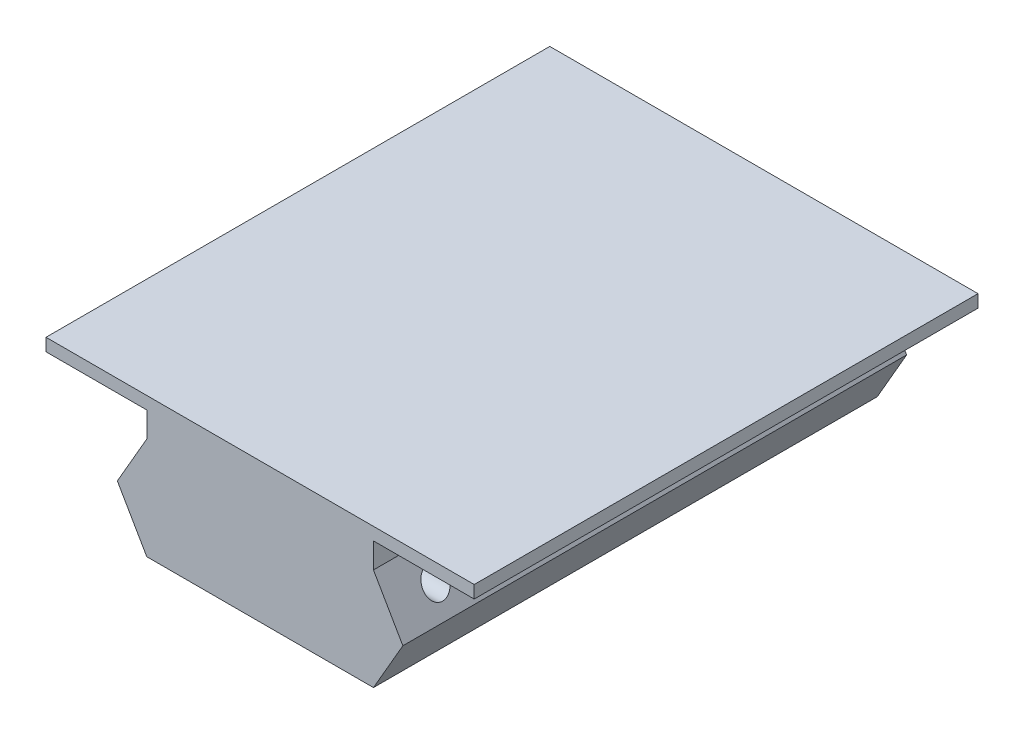
ISO-10303-21;
HEADER;
FILE_DESCRIPTION(('STEP AP214'),'2;1');
FILE_NAME('part.step','',(''),(''),'','','');
FILE_SCHEMA(('AUTOMOTIVE_DESIGN { 1 0 10303 214 1 1 1 1 }'));
ENDSEC;
DATA;
#1=APPLICATION_CONTEXT('core data for automotive mechanical design processes');
#2=APPLICATION_PROTOCOL_DEFINITION('international standard','automotive_design',2000,#1);
#3=PRODUCT_CONTEXT('',#1,'mechanical');
#4=PRODUCT('Part','Part','',(#3));
#5=PRODUCT_RELATED_PRODUCT_CATEGORY('part','',(#4));
#6=PRODUCT_DEFINITION_FORMATION('','',#4);
#7=PRODUCT_DEFINITION_CONTEXT('part definition',#1,'design');
#8=PRODUCT_DEFINITION('design','',#6,#7);
#9=PRODUCT_DEFINITION_SHAPE('','',#8);
#10=(LENGTH_UNIT() NAMED_UNIT(*) SI_UNIT(.MILLI.,.METRE.));
#11=(NAMED_UNIT(*) PLANE_ANGLE_UNIT() SI_UNIT($,.RADIAN.));
#12=(NAMED_UNIT(*) SI_UNIT($,.STERADIAN.) SOLID_ANGLE_UNIT());
#13=UNCERTAINTY_MEASURE_WITH_UNIT(LENGTH_MEASURE(1.E-05),#10,'distance_accuracy_value','');
#14=(GEOMETRIC_REPRESENTATION_CONTEXT(3) GLOBAL_UNCERTAINTY_ASSIGNED_CONTEXT((#13)) GLOBAL_UNIT_ASSIGNED_CONTEXT((#10,
#11,#12)) REPRESENTATION_CONTEXT('',''));
#15=CARTESIAN_POINT('',(0.,0.,0.));
#16=DIRECTION('',(0.,0.,1.));
#17=DIRECTION('',(1.,0.,0.));
#18=AXIS2_PLACEMENT_3D('',#15,#16,#17);
#19=CARTESIAN_POINT('',(-16.3069995829945,10.0886772713467,-40.));
#20=DIRECTION('',(1.,0.,0.));
#21=DIRECTION('',(0.,0.,-1.));
#22=AXIS2_PLACEMENT_3D('',#19,#20,#21);
#23=PLANE('',#22);
#24=DIRECTION('',(0.,1.,0.));
#25=VECTOR('',#24,1.);
#26=CARTESIAN_POINT('',(-16.3069995829945,10.0886772713467,0.));
#27=LINE('',#26,#25);
#28=CARTESIAN_POINT('',(-16.3069995829945,10.0886772713467,0.));
#29=VERTEX_POINT('',#28);
#30=CARTESIAN_POINT('',(-16.3069995829945,11.0886772713467,0.));
#31=VERTEX_POINT('',#30);
#32=EDGE_CURVE('E172',#29,#31,#27,.T.);
#33=ORIENTED_EDGE('',*,*,#32,.T.);
#34=DIRECTION('',(0.,0.,1.));
#35=VECTOR('',#34,1.);
#36=CARTESIAN_POINT('',(-16.3069995829945,11.0886772713467,-40.));
#37=LINE('',#36,#35);
#38=CARTESIAN_POINT('',(-16.3069995829945,11.0886772713467,-40.));
#39=VERTEX_POINT('',#38);
#40=EDGE_CURVE('E11',#39,#31,#37,.T.);
#41=ORIENTED_EDGE('',*,*,#40,.F.);
#42=DIRECTION('',(0.,1.,0.));
#43=VECTOR('',#42,1.);
#44=CARTESIAN_POINT('',(-16.3069995829945,10.0886772713467,-40.));
#45=LINE('',#44,#43);
#46=CARTESIAN_POINT('',(-16.3069995829945,10.0886772713467,-40.));
#47=VERTEX_POINT('',#46);
#48=EDGE_CURVE('E207',#47,#39,#45,.T.);
#49=ORIENTED_EDGE('',*,*,#48,.F.);
#50=DIRECTION('',(0.,0.,1.));
#51=VECTOR('',#50,1.);
#52=CARTESIAN_POINT('',(-16.3069995829945,10.0886772713467,-40.));
#53=LINE('',#52,#51);
#54=EDGE_CURVE('E168',#47,#29,#53,.T.);
#55=ORIENTED_EDGE('',*,*,#54,.T.);
#56=EDGE_LOOP('',(#33,#41,#49,#55));
#57=FACE_BOUND('',#56,.T.);
#58=ADVANCED_FACE('F45',(#57),#23,.F.);
#59=CARTESIAN_POINT('',(-16.3069995829945,11.0886772713467,-40.));
#60=DIRECTION('',(0.,-1.,0.));
#61=DIRECTION('',(0.,0.,-1.));
#62=AXIS2_PLACEMENT_3D('',#59,#60,#61);
#63=PLANE('',#62);
#64=DIRECTION('',(1.,0.,0.));
#65=VECTOR('',#64,1.);
#66=CARTESIAN_POINT('',(-16.3069995829945,11.0886772713467,0.));
#67=LINE('',#66,#65);
#68=CARTESIAN_POINT('',(17.6930004170055,11.0886772713467,0.));
#69=VERTEX_POINT('',#68);
#70=EDGE_CURVE('E176',#31,#69,#67,.T.);
#71=ORIENTED_EDGE('',*,*,#70,.T.);
#72=DIRECTION('',(0.,0.,1.));
#73=VECTOR('',#72,1.);
#74=CARTESIAN_POINT('',(17.6930004170055,11.0886772713467,-40.));
#75=LINE('',#74,#73);
#76=CARTESIAN_POINT('',(17.6930004170055,11.0886772713467,-40.));
#77=VERTEX_POINT('',#76);
#78=EDGE_CURVE('E55',#77,#69,#75,.T.);
#79=ORIENTED_EDGE('',*,*,#78,.F.);
#80=DIRECTION('',(1.,0.,0.));
#81=VECTOR('',#80,1.);
#82=CARTESIAN_POINT('',(-16.3069995829945,11.0886772713467,-40.));
#83=LINE('',#82,#81);
#84=EDGE_CURVE('E119',#39,#77,#83,.T.);
#85=ORIENTED_EDGE('',*,*,#84,.F.);
#86=ORIENTED_EDGE('',*,*,#40,.T.);
#87=EDGE_LOOP('',(#71,#79,#85,#86));
#88=FACE_BOUND('',#87,.T.);
#89=ADVANCED_FACE('F400',(#88),#63,.F.);
#90=CARTESIAN_POINT('',(17.6930004170055,11.0886772713467,-40.));
#91=DIRECTION('',(-1.,0.,0.));
#92=DIRECTION('',(0.,0.,1.));
#93=AXIS2_PLACEMENT_3D('',#90,#91,#92);
#94=PLANE('',#93);
#95=DIRECTION('',(0.,-1.,0.));
#96=VECTOR('',#95,1.);
#97=CARTESIAN_POINT('',(17.6930004170055,11.0886772713467,0.));
#98=LINE('',#97,#96);
#99=CARTESIAN_POINT('',(17.6930004170055,10.0886772713467,0.));
#100=VERTEX_POINT('',#99);
#101=EDGE_CURVE('E180',#69,#100,#98,.T.);
#102=ORIENTED_EDGE('',*,*,#101,.T.);
#103=DIRECTION('',(0.,0.,1.));
#104=VECTOR('',#103,1.);
#105=CARTESIAN_POINT('',(17.6930004170055,10.0886772713467,-40.));
#106=LINE('',#105,#104);
#107=CARTESIAN_POINT('',(17.6930004170055,10.0886772713467,-40.));
#108=VERTEX_POINT('',#107);
#109=EDGE_CURVE('E234',#108,#100,#106,.T.);
#110=ORIENTED_EDGE('',*,*,#109,.F.);
#111=DIRECTION('',(0.,-1.,0.));
#112=VECTOR('',#111,1.);
#113=CARTESIAN_POINT('',(17.6930004170055,11.0886772713467,-40.));
#114=LINE('',#113,#112);
#115=EDGE_CURVE('E307',#77,#108,#114,.T.);
#116=ORIENTED_EDGE('',*,*,#115,.F.);
#117=ORIENTED_EDGE('',*,*,#78,.T.);
#118=EDGE_LOOP('',(#102,#110,#116,#117));
#119=FACE_BOUND('',#118,.T.);
#120=ADVANCED_FACE('F404',(#119),#94,.F.);
#121=CARTESIAN_POINT('',(17.6930004170055,10.0886772713467,-40.));
#122=DIRECTION('',(0.,1.,0.));
#123=DIRECTION('',(0.,0.,1.));
#124=AXIS2_PLACEMENT_3D('',#121,#122,#123);
#125=PLANE('',#124);
#126=DIRECTION('',(-1.,0.,0.));
#127=VECTOR('',#126,1.);
#128=CARTESIAN_POINT('',(17.6930004170055,10.0886772713467,0.));
#129=LINE('',#128,#127);
#130=CARTESIAN_POINT('',(9.69300041700538,10.0886772713467,0.));
#131=VERTEX_POINT('',#130);
#132=EDGE_CURVE('E183',#100,#131,#129,.T.);
#133=ORIENTED_EDGE('',*,*,#132,.T.);
#134=DIRECTION('',(0.,0.,1.));
#135=VECTOR('',#134,1.);
#136=CARTESIAN_POINT('',(9.69300041700538,10.0886772713467,-40.));
#137=LINE('',#136,#135);
#138=CARTESIAN_POINT('',(9.69300041700538,10.0886772713467,-40.));
#139=VERTEX_POINT('',#138);
#140=EDGE_CURVE('E230',#139,#131,#137,.T.);
#141=ORIENTED_EDGE('',*,*,#140,.F.);
#142=DIRECTION('',(-1.,0.,0.));
#143=VECTOR('',#142,1.);
#144=CARTESIAN_POINT('',(17.6930004170055,10.0886772713467,-40.));
#145=LINE('',#144,#143);
#146=EDGE_CURVE('E310',#108,#139,#145,.T.);
#147=ORIENTED_EDGE('',*,*,#146,.F.);
#148=ORIENTED_EDGE('',*,*,#109,.T.);
#149=EDGE_LOOP('',(#133,#141,#147,#148));
#150=FACE_BOUND('',#149,.T.);
#151=ADVANCED_FACE('F408',(#150),#125,.F.);
#152=CARTESIAN_POINT('',(9.69300041700538,10.0886772713467,-40.));
#153=DIRECTION('',(-1.,0.,0.));
#154=DIRECTION('',(0.,-1.,0.));
#155=AXIS2_PLACEMENT_3D('',#152,#153,#154);
#156=PLANE('',#155);
#157=DIRECTION('',(0.,-1.,0.));
#158=VECTOR('',#157,1.);
#159=CARTESIAN_POINT('',(9.69300041700538,10.0886772713467,0.));
#160=LINE('',#159,#158);
#161=CARTESIAN_POINT('',(9.69300041700546,8.08867727134664,0.));
#162=VERTEX_POINT('',#161);
#163=EDGE_CURVE('E186',#131,#162,#160,.T.);
#164=ORIENTED_EDGE('',*,*,#163,.T.);
#165=DIRECTION('',(0.,0.,1.));
#166=VECTOR('',#165,1.);
#167=CARTESIAN_POINT('',(9.69300041700546,8.08867727134664,-40.));
#168=LINE('',#167,#166);
#169=CARTESIAN_POINT('',(9.69300041700546,8.08867727134664,-40.));
#170=VERTEX_POINT('',#169);
#171=EDGE_CURVE('E226',#170,#162,#168,.T.);
#172=ORIENTED_EDGE('',*,*,#171,.F.);
#173=DIRECTION('',(0.,-1.,0.));
#174=VECTOR('',#173,1.);
#175=CARTESIAN_POINT('',(9.69300041700538,10.0886772713467,-40.));
#176=LINE('',#175,#174);
#177=EDGE_CURVE('E313',#139,#170,#176,.T.);
#178=ORIENTED_EDGE('',*,*,#177,.F.);
#179=ORIENTED_EDGE('',*,*,#140,.T.);
#180=EDGE_LOOP('',(#164,#172,#178,#179));
#181=FACE_BOUND('',#180,.T.);
#182=ADVANCED_FACE('F341',(#181),#156,.F.);
#183=CARTESIAN_POINT('',(9.69300041700546,8.08867727134664,-40.));
#184=DIRECTION('',(-0.866025403784435,-0.500000000000007,0.));
#185=DIRECTION('',(0.500000000000007,-0.866025403784435,0.));
#186=AXIS2_PLACEMENT_3D('',#183,#184,#185);
#187=PLANE('',#186);
#188=CARTESIAN_POINT('',(10.9054359823037,5.98867727134664,-7.42));
#189=DIRECTION('',(-0.866025403784435,-0.500000000000007,0.));
#190=DIRECTION('',(0.500000000000007,-0.866025403784435,0.));
#191=AXIS2_PLACEMENT_3D('',#188,#189,#190);
#192=ELLIPSE('',#191,1.15470053837926,1.);
#193=CARTESIAN_POINT('',(11.4827862514933,4.98867727134664,-7.42));
#194=VERTEX_POINT('',#193);
#195=EDGE_CURVE('E245',#194,#194,#192,.T.);
#196=ORIENTED_EDGE('',*,*,#195,.T.);
#197=EDGE_LOOP('',(#196));
#198=FACE_BOUND('',#197,.T.);
#199=CARTESIAN_POINT('',(10.9054359823037,5.98867727134664,-11.13));
#200=DIRECTION('',(-0.866025403784435,-0.500000000000007,0.));
#201=DIRECTION('',(0.500000000000007,-0.866025403784435,0.));
#202=AXIS2_PLACEMENT_3D('',#199,#200,#201);
#203=ELLIPSE('',#202,1.15470053837926,1.);
#204=CARTESIAN_POINT('',(11.4827862514933,4.98867727134664,-11.13));
#205=VERTEX_POINT('',#204);
#206=EDGE_CURVE('E283',#205,#205,#203,.T.);
#207=ORIENTED_EDGE('',*,*,#206,.T.);
#208=EDGE_LOOP('',(#207));
#209=FACE_BOUND('',#208,.T.);
#210=CARTESIAN_POINT('',(10.9054359823037,5.98867727134664,-14.84));
#211=DIRECTION('',(-0.866025403784435,-0.500000000000007,0.));
#212=DIRECTION('',(0.500000000000007,-0.866025403784435,0.));
#213=AXIS2_PLACEMENT_3D('',#210,#211,#212);
#214=ELLIPSE('',#213,1.15470053837926,1.);
#215=CARTESIAN_POINT('',(11.4827862514933,4.98867727134664,-14.84));
#216=VERTEX_POINT('',#215);
#217=EDGE_CURVE('E279',#216,#216,#214,.T.);
#218=ORIENTED_EDGE('',*,*,#217,.T.);
#219=EDGE_LOOP('',(#218));
#220=FACE_BOUND('',#219,.T.);
#221=CARTESIAN_POINT('',(10.9054359823037,5.98867727134664,-18.55));
#222=DIRECTION('',(-0.866025403784435,-0.500000000000007,0.));
#223=DIRECTION('',(0.500000000000007,-0.866025403784435,0.));
#224=AXIS2_PLACEMENT_3D('',#221,#222,#223);
#225=ELLIPSE('',#224,1.15470053837926,1.);
#226=CARTESIAN_POINT('',(11.4827862514933,4.98867727134664,-18.55));
#227=VERTEX_POINT('',#226);
#228=EDGE_CURVE('E275',#227,#227,#225,.T.);
#229=ORIENTED_EDGE('',*,*,#228,.T.);
#230=EDGE_LOOP('',(#229));
#231=FACE_BOUND('',#230,.T.);
#232=CARTESIAN_POINT('',(10.9054359823037,5.98867727134664,-22.26));
#233=DIRECTION('',(-0.866025403784435,-0.500000000000007,0.));
#234=DIRECTION('',(0.500000000000007,-0.866025403784435,0.));
#235=AXIS2_PLACEMENT_3D('',#232,#233,#234);
#236=ELLIPSE('',#235,1.15470053837926,1.);
#237=CARTESIAN_POINT('',(11.4827862514933,4.98867727134664,-22.26));
#238=VERTEX_POINT('',#237);
#239=EDGE_CURVE('E270',#238,#238,#236,.T.);
#240=ORIENTED_EDGE('',*,*,#239,.T.);
#241=EDGE_LOOP('',(#240));
#242=FACE_BOUND('',#241,.T.);
#243=CARTESIAN_POINT('',(10.9054359823037,5.98867727134664,-25.97));
#244=DIRECTION('',(-0.866025403784435,-0.500000000000007,0.));
#245=DIRECTION('',(0.500000000000007,-0.866025403784435,0.));
#246=AXIS2_PLACEMENT_3D('',#243,#244,#245);
#247=ELLIPSE('',#246,1.15470053837926,1.);
#248=CARTESIAN_POINT('',(11.4827862514933,4.98867727134664,-25.97));
#249=VERTEX_POINT('',#248);
#250=EDGE_CURVE('E265',#249,#249,#247,.T.);
#251=ORIENTED_EDGE('',*,*,#250,.T.);
#252=EDGE_LOOP('',(#251));
#253=FACE_BOUND('',#252,.T.);
#254=CARTESIAN_POINT('',(10.9054359823037,5.98867727134664,-29.68));
#255=DIRECTION('',(-0.866025403784435,-0.500000000000007,0.));
#256=DIRECTION('',(0.500000000000007,-0.866025403784435,0.));
#257=AXIS2_PLACEMENT_3D('',#254,#255,#256);
#258=ELLIPSE('',#257,1.15470053837926,1.);
#259=CARTESIAN_POINT('',(11.4827862514933,4.98867727134664,-29.68));
#260=VERTEX_POINT('',#259);
#261=EDGE_CURVE('E260',#260,#260,#258,.T.);
#262=ORIENTED_EDGE('',*,*,#261,.T.);
#263=EDGE_LOOP('',(#262));
#264=FACE_BOUND('',#263,.T.);
#265=CARTESIAN_POINT('',(10.9054359823037,5.98867727134664,-33.39));
#266=DIRECTION('',(-0.866025403784435,-0.500000000000007,0.));
#267=DIRECTION('',(0.500000000000007,-0.866025403784435,0.));
#268=AXIS2_PLACEMENT_3D('',#265,#266,#267);
#269=ELLIPSE('',#268,1.15470053837926,1.);
#270=CARTESIAN_POINT('',(11.4827862514933,4.98867727134664,-33.39));
#271=VERTEX_POINT('',#270);
#272=EDGE_CURVE('E255',#271,#271,#269,.T.);
#273=ORIENTED_EDGE('',*,*,#272,.T.);
#274=EDGE_LOOP('',(#273));
#275=FACE_BOUND('',#274,.T.);
#276=CARTESIAN_POINT('',(10.9054359823037,5.98867727134664,-37.1));
#277=DIRECTION('',(-0.866025403784435,-0.500000000000007,0.));
#278=DIRECTION('',(0.500000000000007,-0.866025403784435,0.));
#279=AXIS2_PLACEMENT_3D('',#276,#277,#278);
#280=ELLIPSE('',#279,1.15470053837926,1.);
#281=CARTESIAN_POINT('',(11.4827862514933,4.98867727134664,-37.1));
#282=VERTEX_POINT('',#281);
#283=EDGE_CURVE('E250',#282,#282,#280,.T.);
#284=ORIENTED_EDGE('',*,*,#283,.T.);
#285=EDGE_LOOP('',(#284));
#286=FACE_BOUND('',#285,.T.);
#287=CARTESIAN_POINT('',(10.9054359823037,5.98867727134664,-3.71));
#288=DIRECTION('',(-0.866025403784435,-0.500000000000007,0.));
#289=DIRECTION('',(0.500000000000007,-0.866025403784435,0.));
#290=AXIS2_PLACEMENT_3D('',#287,#288,#289);
#291=ELLIPSE('',#290,1.15470053837926,1.);
#292=CARTESIAN_POINT('',(11.4827862514933,4.98867727134664,-3.71));
#293=VERTEX_POINT('',#292);
#294=EDGE_CURVE('E177',#293,#293,#291,.T.);
#295=ORIENTED_EDGE('',*,*,#294,.T.);
#296=EDGE_LOOP('',(#295));
#297=FACE_BOUND('',#296,.T.);
#298=DIRECTION('',(0.500000000000007,-0.866025403784435,0.));
#299=VECTOR('',#298,1.);
#300=CARTESIAN_POINT('',(9.69300041700546,8.08867727134664,0.));
#301=LINE('',#300,#299);
#302=CARTESIAN_POINT('',(12.0280004170055,4.04433863567331,0.));
#303=VERTEX_POINT('',#302);
#304=EDGE_CURVE('E189',#162,#303,#301,.T.);
#305=ORIENTED_EDGE('',*,*,#304,.T.);
#306=DIRECTION('',(0.,0.,1.));
#307=VECTOR('',#306,1.);
#308=CARTESIAN_POINT('',(12.0280004170055,4.04433863567331,-40.));
#309=LINE('',#308,#307);
#310=CARTESIAN_POINT('',(12.0280004170055,4.04433863567331,-40.));
#311=VERTEX_POINT('',#310);
#312=EDGE_CURVE('E222',#311,#303,#309,.T.);
#313=ORIENTED_EDGE('',*,*,#312,.F.);
#314=DIRECTION('',(0.500000000000007,-0.866025403784435,0.));
#315=VECTOR('',#314,1.);
#316=CARTESIAN_POINT('',(9.69300041700546,8.08867727134664,-40.));
#317=LINE('',#316,#315);
#318=EDGE_CURVE('E316',#170,#311,#317,.T.);
#319=ORIENTED_EDGE('',*,*,#318,.F.);
#320=ORIENTED_EDGE('',*,*,#171,.T.);
#321=EDGE_LOOP('',(#305,#313,#319,#320));
#322=FACE_BOUND('',#321,.T.);
#323=ADVANCED_FACE('F337',(#198,#209,#220,#231,#242,#253,#264,#275,#286,#297,#322),#187,.F.);
#324=CARTESIAN_POINT('',(12.0280004170055,4.04433863567331,-40.));
#325=DIRECTION('',(-0.866025403784441,0.499999999999997,0.));
#326=DIRECTION('',(-0.499999999999997,-0.866025403784441,0.));
#327=AXIS2_PLACEMENT_3D('',#324,#325,#326);
#328=PLANE('',#327);
#329=DIRECTION('',(-0.499999999999997,-0.866025403784441,0.));
#330=VECTOR('',#329,1.);
#331=CARTESIAN_POINT('',(12.0280004170055,4.04433863567331,0.));
#332=LINE('',#331,#330);
#333=CARTESIAN_POINT('',(9.69300041700553,0.,0.));
#334=VERTEX_POINT('',#333);
#335=EDGE_CURVE('E192',#303,#334,#332,.T.);
#336=ORIENTED_EDGE('',*,*,#335,.T.);
#337=DIRECTION('',(0.,0.,1.));
#338=VECTOR('',#337,1.);
#339=CARTESIAN_POINT('',(9.69300041700553,0.,-40.));
#340=LINE('',#339,#338);
#341=CARTESIAN_POINT('',(9.69300041700553,0.,-40.));
#342=VERTEX_POINT('',#341);
#343=EDGE_CURVE('E218',#342,#334,#340,.T.);
#344=ORIENTED_EDGE('',*,*,#343,.F.);
#345=DIRECTION('',(-0.499999999999997,-0.866025403784441,0.));
#346=VECTOR('',#345,1.);
#347=CARTESIAN_POINT('',(12.0280004170055,4.04433863567331,-40.));
#348=LINE('',#347,#346);
#349=EDGE_CURVE('E319',#311,#342,#348,.T.);
#350=ORIENTED_EDGE('',*,*,#349,.F.);
#351=ORIENTED_EDGE('',*,*,#312,.T.);
#352=EDGE_LOOP('',(#336,#344,#350,#351));
#353=FACE_BOUND('',#352,.T.);
#354=ADVANCED_FACE('F340',(#353),#328,.F.);
#355=CARTESIAN_POINT('',(9.69300041700553,0.,-40.));
#356=DIRECTION('',(0.,1.,0.));
#357=DIRECTION('',(-1.,0.,0.));
#358=AXIS2_PLACEMENT_3D('',#355,#356,#357);
#359=PLANE('',#358);
#360=DIRECTION('',(-1.,0.,0.));
#361=VECTOR('',#360,1.);
#362=CARTESIAN_POINT('',(9.69300041700553,0.,0.));
#363=LINE('',#362,#361);
#364=CARTESIAN_POINT('',(-8.30699958299447,0.,0.));
#365=VERTEX_POINT('',#364);
#366=EDGE_CURVE('E195',#334,#365,#363,.T.);
#367=ORIENTED_EDGE('',*,*,#366,.T.);
#368=DIRECTION('',(0.,0.,1.));
#369=VECTOR('',#368,1.);
#370=CARTESIAN_POINT('',(-8.30699958299447,0.,-40.));
#371=LINE('',#370,#369);
#372=CARTESIAN_POINT('',(-8.30699958299447,0.,-40.));
#373=VERTEX_POINT('',#372);
#374=EDGE_CURVE('E214',#373,#365,#371,.T.);
#375=ORIENTED_EDGE('',*,*,#374,.F.);
#376=DIRECTION('',(-1.,0.,0.));
#377=VECTOR('',#376,1.);
#378=CARTESIAN_POINT('',(9.69300041700553,0.,-40.));
#379=LINE('',#378,#377);
#380=EDGE_CURVE('E322',#342,#373,#379,.T.);
#381=ORIENTED_EDGE('',*,*,#380,.F.);
#382=ORIENTED_EDGE('',*,*,#343,.T.);
#383=EDGE_LOOP('',(#367,#375,#381,#382));
#384=FACE_BOUND('',#383,.T.);
#385=ADVANCED_FACE('F381',(#384),#359,.F.);
#386=CARTESIAN_POINT('',(-8.30699958299447,0.,-40.));
#387=DIRECTION('',(0.866025403784439,0.5,0.));
#388=DIRECTION('',(-0.5,0.866025403784439,0.));
#389=AXIS2_PLACEMENT_3D('',#386,#387,#388);
#390=PLANE('',#389);
#391=DIRECTION('',(-0.5,0.866025403784439,0.));
#392=VECTOR('',#391,1.);
#393=CARTESIAN_POINT('',(-8.30699958299447,0.,0.));
#394=LINE('',#393,#392);
#395=CARTESIAN_POINT('',(-10.6419995829945,4.04433863567338,0.));
#396=VERTEX_POINT('',#395);
#397=EDGE_CURVE('E198',#365,#396,#394,.T.);
#398=ORIENTED_EDGE('',*,*,#397,.T.);
#399=DIRECTION('',(0.,0.,1.));
#400=VECTOR('',#399,1.);
#401=CARTESIAN_POINT('',(-10.6419995829945,4.04433863567338,-40.));
#402=LINE('',#401,#400);
#403=CARTESIAN_POINT('',(-10.6419995829945,4.04433863567338,-40.));
#404=VERTEX_POINT('',#403);
#405=EDGE_CURVE('E161',#404,#396,#402,.T.);
#406=ORIENTED_EDGE('',*,*,#405,.F.);
#407=DIRECTION('',(-0.5,0.866025403784439,0.));
#408=VECTOR('',#407,1.);
#409=CARTESIAN_POINT('',(-8.30699958299447,0.,-40.));
#410=LINE('',#409,#408);
#411=EDGE_CURVE('E150',#373,#404,#410,.T.);
#412=ORIENTED_EDGE('',*,*,#411,.F.);
#413=ORIENTED_EDGE('',*,*,#374,.T.);
#414=EDGE_LOOP('',(#398,#406,#412,#413));
#415=FACE_BOUND('',#414,.T.);
#416=ADVANCED_FACE('F384',(#415),#390,.F.);
#417=CARTESIAN_POINT('',(-10.6419995829945,4.04433863567338,-40.));
#418=DIRECTION('',(0.866025403784436,-0.500000000000004,0.));
#419=DIRECTION('',(0.500000000000004,0.866025403784436,0.));
#420=AXIS2_PLACEMENT_3D('',#417,#418,#419);
#421=PLANE('',#420);
#422=CARTESIAN_POINT('',(-9.51943514829274,5.98867727134664,-7.42));
#423=DIRECTION('',(0.866025403784436,-0.500000000000004,0.));
#424=DIRECTION('',(0.500000000000004,0.866025403784436,0.));
#425=AXIS2_PLACEMENT_3D('',#422,#423,#424);
#426=ELLIPSE('',#425,1.15470053837925,1.);
#427=CARTESIAN_POINT('',(-8.94208487910311,6.98867727134664,-7.42));
#428=VERTEX_POINT('',#427);
#429=EDGE_CURVE('E48',#428,#428,#426,.T.);
#430=ORIENTED_EDGE('',*,*,#429,.T.);
#431=EDGE_LOOP('',(#430));
#432=FACE_BOUND('',#431,.T.);
#433=CARTESIAN_POINT('',(-9.51943514829274,5.98867727134664,-11.13));
#434=DIRECTION('',(0.866025403784436,-0.500000000000004,0.));
#435=DIRECTION('',(0.500000000000004,0.866025403784436,0.));
#436=AXIS2_PLACEMENT_3D('',#433,#434,#435);
#437=ELLIPSE('',#436,1.15470053837925,1.);
#438=CARTESIAN_POINT('',(-8.94208487910311,6.98867727134664,-11.13));
#439=VERTEX_POINT('',#438);
#440=EDGE_CURVE('E280',#439,#439,#437,.T.);
#441=ORIENTED_EDGE('',*,*,#440,.T.);
#442=EDGE_LOOP('',(#441));
#443=FACE_BOUND('',#442,.T.);
#444=CARTESIAN_POINT('',(-9.51943514829274,5.98867727134664,-14.84));
#445=DIRECTION('',(0.866025403784436,-0.500000000000004,0.));
#446=DIRECTION('',(0.500000000000004,0.866025403784436,0.));
#447=AXIS2_PLACEMENT_3D('',#444,#445,#446);
#448=ELLIPSE('',#447,1.15470053837925,1.);
#449=CARTESIAN_POINT('',(-8.94208487910311,6.98867727134664,-14.84));
#450=VERTEX_POINT('',#449);
#451=EDGE_CURVE('E276',#450,#450,#448,.T.);
#452=ORIENTED_EDGE('',*,*,#451,.T.);
#453=EDGE_LOOP('',(#452));
#454=FACE_BOUND('',#453,.T.);
#455=CARTESIAN_POINT('',(-9.51943514829274,5.98867727134664,-18.55));
#456=DIRECTION('',(0.866025403784436,-0.500000000000004,0.));
#457=DIRECTION('',(0.500000000000004,0.866025403784436,0.));
#458=AXIS2_PLACEMENT_3D('',#455,#456,#457);
#459=ELLIPSE('',#458,1.15470053837925,1.);
#460=CARTESIAN_POINT('',(-8.94208487910311,6.98867727134664,-18.55));
#461=VERTEX_POINT('',#460);
#462=EDGE_CURVE('E271',#461,#461,#459,.T.);
#463=ORIENTED_EDGE('',*,*,#462,.T.);
#464=EDGE_LOOP('',(#463));
#465=FACE_BOUND('',#464,.T.);
#466=CARTESIAN_POINT('',(-9.51943514829274,5.98867727134664,-22.26));
#467=DIRECTION('',(0.866025403784436,-0.500000000000004,0.));
#468=DIRECTION('',(0.500000000000004,0.866025403784436,0.));
#469=AXIS2_PLACEMENT_3D('',#466,#467,#468);
#470=ELLIPSE('',#469,1.15470053837925,1.);
#471=CARTESIAN_POINT('',(-8.94208487910311,6.98867727134664,-22.26));
#472=VERTEX_POINT('',#471);
#473=EDGE_CURVE('E266',#472,#472,#470,.T.);
#474=ORIENTED_EDGE('',*,*,#473,.T.);
#475=EDGE_LOOP('',(#474));
#476=FACE_BOUND('',#475,.T.);
#477=CARTESIAN_POINT('',(-9.51943514829274,5.98867727134664,-25.97));
#478=DIRECTION('',(0.866025403784436,-0.500000000000004,0.));
#479=DIRECTION('',(0.500000000000004,0.866025403784436,0.));
#480=AXIS2_PLACEMENT_3D('',#477,#478,#479);
#481=ELLIPSE('',#480,1.15470053837925,1.);
#482=CARTESIAN_POINT('',(-8.94208487910311,6.98867727134664,-25.97));
#483=VERTEX_POINT('',#482);
#484=EDGE_CURVE('E261',#483,#483,#481,.T.);
#485=ORIENTED_EDGE('',*,*,#484,.T.);
#486=EDGE_LOOP('',(#485));
#487=FACE_BOUND('',#486,.T.);
#488=CARTESIAN_POINT('',(-9.51943514829274,5.98867727134664,-29.68));
#489=DIRECTION('',(0.866025403784436,-0.500000000000004,0.));
#490=DIRECTION('',(0.500000000000004,0.866025403784436,0.));
#491=AXIS2_PLACEMENT_3D('',#488,#489,#490);
#492=ELLIPSE('',#491,1.15470053837925,1.);
#493=CARTESIAN_POINT('',(-8.94208487910311,6.98867727134664,-29.68));
#494=VERTEX_POINT('',#493);
#495=EDGE_CURVE('E256',#494,#494,#492,.T.);
#496=ORIENTED_EDGE('',*,*,#495,.T.);
#497=EDGE_LOOP('',(#496));
#498=FACE_BOUND('',#497,.T.);
#499=CARTESIAN_POINT('',(-9.51943514829274,5.98867727134664,-33.39));
#500=DIRECTION('',(0.866025403784436,-0.500000000000004,0.));
#501=DIRECTION('',(0.500000000000004,0.866025403784436,0.));
#502=AXIS2_PLACEMENT_3D('',#499,#500,#501);
#503=ELLIPSE('',#502,1.15470053837925,1.);
#504=CARTESIAN_POINT('',(-8.94208487910311,6.98867727134664,-33.39));
#505=VERTEX_POINT('',#504);
#506=EDGE_CURVE('E251',#505,#505,#503,.T.);
#507=ORIENTED_EDGE('',*,*,#506,.T.);
#508=EDGE_LOOP('',(#507));
#509=FACE_BOUND('',#508,.T.);
#510=CARTESIAN_POINT('',(-9.51943514829274,5.98867727134664,-37.1));
#511=DIRECTION('',(0.866025403784436,-0.500000000000004,0.));
#512=DIRECTION('',(0.500000000000004,0.866025403784436,0.));
#513=AXIS2_PLACEMENT_3D('',#510,#511,#512);
#514=ELLIPSE('',#513,1.15470053837925,1.);
#515=CARTESIAN_POINT('',(-8.94208487910311,6.98867727134664,-37.1));
#516=VERTEX_POINT('',#515);
#517=EDGE_CURVE('E246',#516,#516,#514,.T.);
#518=ORIENTED_EDGE('',*,*,#517,.T.);
#519=EDGE_LOOP('',(#518));
#520=FACE_BOUND('',#519,.T.);
#521=CARTESIAN_POINT('',(-9.51943514829274,5.98867727134664,-3.71));
#522=DIRECTION('',(0.866025403784436,-0.500000000000004,0.));
#523=DIRECTION('',(0.500000000000004,0.866025403784436,0.));
#524=AXIS2_PLACEMENT_3D('',#521,#522,#523);
#525=ELLIPSE('',#524,1.15470053837925,1.);
#526=CARTESIAN_POINT('',(-8.94208487910311,6.98867727134664,-3.71));
#527=VERTEX_POINT('',#526);
#528=EDGE_CURVE('E241',#527,#527,#525,.T.);
#529=ORIENTED_EDGE('',*,*,#528,.T.);
#530=EDGE_LOOP('',(#529));
#531=FACE_BOUND('',#530,.T.);
#532=DIRECTION('',(0.500000000000004,0.866025403784436,0.));
#533=VECTOR('',#532,1.);
#534=CARTESIAN_POINT('',(-10.6419995829945,4.04433863567338,0.));
#535=LINE('',#534,#533);
#536=CARTESIAN_POINT('',(-8.30699958299447,8.08867727134671,0.));
#537=VERTEX_POINT('',#536);
#538=EDGE_CURVE('E159',#396,#537,#535,.T.);
#539=ORIENTED_EDGE('',*,*,#538,.T.);
#540=DIRECTION('',(0.,0.,1.));
#541=VECTOR('',#540,1.);
#542=CARTESIAN_POINT('',(-8.30699958299447,8.08867727134671,-40.));
#543=LINE('',#542,#541);
#544=CARTESIAN_POINT('',(-8.30699958299447,8.08867727134671,-40.));
#545=VERTEX_POINT('',#544);
#546=EDGE_CURVE('E156',#545,#537,#543,.T.);
#547=ORIENTED_EDGE('',*,*,#546,.F.);
#548=DIRECTION('',(0.500000000000004,0.866025403784436,0.));
#549=VECTOR('',#548,1.);
#550=CARTESIAN_POINT('',(-10.6419995829945,4.04433863567338,-40.));
#551=LINE('',#550,#549);
#552=EDGE_CURVE('E144',#404,#545,#551,.T.);
#553=ORIENTED_EDGE('',*,*,#552,.F.);
#554=ORIENTED_EDGE('',*,*,#405,.T.);
#555=EDGE_LOOP('',(#539,#547,#553,#554));
#556=FACE_BOUND('',#555,.T.);
#557=ADVANCED_FACE('F157',(#432,#443,#454,#465,#476,#487,#498,#509,#520,#531,#556),#421,.F.);
#558=CARTESIAN_POINT('',(-8.30699958299447,8.08867727134671,-40.));
#559=DIRECTION('',(1.,0.,0.));
#560=DIRECTION('',(0.,0.,-1.));
#561=AXIS2_PLACEMENT_3D('',#558,#559,#560);
#562=PLANE('',#561);
#563=DIRECTION('',(0.,1.,0.));
#564=VECTOR('',#563,1.);
#565=CARTESIAN_POINT('',(-8.30699958299447,8.08867727134671,0.));
#566=LINE('',#565,#564);
#567=CARTESIAN_POINT('',(-8.30699958299447,10.0886772713467,0.));
#568=VERTEX_POINT('',#567);
#569=EDGE_CURVE('E105',#537,#568,#566,.T.);
#570=ORIENTED_EDGE('',*,*,#569,.T.);
#571=DIRECTION('',(0.,0.,1.));
#572=VECTOR('',#571,1.);
#573=CARTESIAN_POINT('',(-8.30699958299447,10.0886772713467,-40.));
#574=LINE('',#573,#572);
#575=CARTESIAN_POINT('',(-8.30699958299447,10.0886772713467,-40.));
#576=VERTEX_POINT('',#575);
#577=EDGE_CURVE('E162',#576,#568,#574,.T.);
#578=ORIENTED_EDGE('',*,*,#577,.F.);
#579=DIRECTION('',(0.,1.,0.));
#580=VECTOR('',#579,1.);
#581=CARTESIAN_POINT('',(-8.30699958299447,8.08867727134671,-40.));
#582=LINE('',#581,#580);
#583=EDGE_CURVE('E148',#545,#576,#582,.T.);
#584=ORIENTED_EDGE('',*,*,#583,.F.);
#585=ORIENTED_EDGE('',*,*,#546,.T.);
#586=EDGE_LOOP('',(#570,#578,#584,#585));
#587=FACE_BOUND('',#586,.T.);
#588=ADVANCED_FACE('F164',(#587),#562,.F.);
#589=CARTESIAN_POINT('',(-8.30699958299447,10.0886772713467,-40.));
#590=DIRECTION('',(0.,1.,0.));
#591=DIRECTION('',(-1.,0.,0.));
#592=AXIS2_PLACEMENT_3D('',#589,#590,#591);
#593=PLANE('',#592);
#594=DIRECTION('',(-1.,0.,0.));
#595=VECTOR('',#594,1.);
#596=CARTESIAN_POINT('',(-8.30699958299447,10.0886772713467,0.));
#597=LINE('',#596,#595);
#598=EDGE_CURVE('E111',#568,#29,#597,.T.);
#599=ORIENTED_EDGE('',*,*,#598,.T.);
#600=ORIENTED_EDGE('',*,*,#54,.F.);
#601=DIRECTION('',(-1.,0.,0.));
#602=VECTOR('',#601,1.);
#603=CARTESIAN_POINT('',(-8.30699958299447,10.0886772713467,-40.));
#604=LINE('',#603,#602);
#605=EDGE_CURVE('E64',#576,#47,#604,.T.);
#606=ORIENTED_EDGE('',*,*,#605,.F.);
#607=ORIENTED_EDGE('',*,*,#577,.T.);
#608=EDGE_LOOP('',(#599,#600,#606,#607));
#609=FACE_BOUND('',#608,.T.);
#610=ADVANCED_FACE('F389',(#609),#593,.F.);
#611=CARTESIAN_POINT('',(0.,0.,-40.));
#612=DIRECTION('',(0.,0.,-1.));
#613=DIRECTION('',(-1.,0.,0.));
#614=AXIS2_PLACEMENT_3D('',#611,#612,#613);
#615=PLANE('',#614);
#616=ORIENTED_EDGE('',*,*,#48,.T.);
#617=ORIENTED_EDGE('',*,*,#84,.T.);
#618=ORIENTED_EDGE('',*,*,#115,.T.);
#619=ORIENTED_EDGE('',*,*,#146,.T.);
#620=ORIENTED_EDGE('',*,*,#177,.T.);
#621=ORIENTED_EDGE('',*,*,#318,.T.);
#622=ORIENTED_EDGE('',*,*,#349,.T.);
#623=ORIENTED_EDGE('',*,*,#380,.T.);
#624=ORIENTED_EDGE('',*,*,#411,.T.);
#625=ORIENTED_EDGE('',*,*,#552,.T.);
#626=ORIENTED_EDGE('',*,*,#583,.T.);
#627=ORIENTED_EDGE('',*,*,#605,.T.);
#628=EDGE_LOOP('',(#616,#617,#618,#619,#620,#621,#622,#623,#624,#625,#626,#627));
#629=FACE_BOUND('',#628,.T.);
#630=ADVANCED_FACE('F146',(#629),#615,.T.);
#631=CARTESIAN_POINT('',(0.,0.,0.));
#632=DIRECTION('',(0.,0.,-1.));
#633=DIRECTION('',(-1.,0.,0.));
#634=AXIS2_PLACEMENT_3D('',#631,#632,#633);
#635=PLANE('',#634);
#636=ORIENTED_EDGE('',*,*,#32,.F.);
#637=ORIENTED_EDGE('',*,*,#598,.F.);
#638=ORIENTED_EDGE('',*,*,#569,.F.);
#639=ORIENTED_EDGE('',*,*,#538,.F.);
#640=ORIENTED_EDGE('',*,*,#397,.F.);
#641=ORIENTED_EDGE('',*,*,#366,.F.);
#642=ORIENTED_EDGE('',*,*,#335,.F.);
#643=ORIENTED_EDGE('',*,*,#304,.F.);
#644=ORIENTED_EDGE('',*,*,#163,.F.);
#645=ORIENTED_EDGE('',*,*,#132,.F.);
#646=ORIENTED_EDGE('',*,*,#101,.F.);
#647=ORIENTED_EDGE('',*,*,#70,.F.);
#648=EDGE_LOOP('',(#636,#637,#638,#639,#640,#641,#642,#643,#644,#645,#646,#647));
#649=FACE_BOUND('',#648,.T.);
#650=ADVANCED_FACE('F377',(#649),#635,.F.);
#651=CARTESIAN_POINT('',(-16.3069995829945,5.98867727134664,-3.71));
#652=DIRECTION('',(1.,0.,0.));
#653=DIRECTION('',(0.,0.,-1.));
#654=AXIS2_PLACEMENT_3D('',#651,#652,#653);
#655=CYLINDRICAL_SURFACE('',#654,1.);
#656=ORIENTED_EDGE('',*,*,#528,.F.);
#657=EDGE_LOOP('',(#656));
#658=FACE_BOUND('',#657,.T.);
#659=ORIENTED_EDGE('',*,*,#294,.F.);
#660=EDGE_LOOP('',(#659));
#661=FACE_BOUND('',#660,.T.);
#662=ADVANCED_FACE('F441',(#658,#661),#655,.F.);
#663=CARTESIAN_POINT('',(-16.3069995829945,5.98867727134664,-37.1));
#664=DIRECTION('',(1.,0.,0.));
#665=DIRECTION('',(0.,0.,-1.));
#666=AXIS2_PLACEMENT_3D('',#663,#664,#665);
#667=CYLINDRICAL_SURFACE('',#666,1.);
#668=ORIENTED_EDGE('',*,*,#517,.F.);
#669=EDGE_LOOP('',(#668));
#670=FACE_BOUND('',#669,.T.);
#671=ORIENTED_EDGE('',*,*,#283,.F.);
#672=EDGE_LOOP('',(#671));
#673=FACE_BOUND('',#672,.T.);
#674=ADVANCED_FACE('F436',(#670,#673),#667,.F.);
#675=CARTESIAN_POINT('',(-16.3069995829945,5.98867727134664,-33.39));
#676=DIRECTION('',(1.,0.,0.));
#677=DIRECTION('',(0.,0.,-1.));
#678=AXIS2_PLACEMENT_3D('',#675,#676,#677);
#679=CYLINDRICAL_SURFACE('',#678,1.);
#680=ORIENTED_EDGE('',*,*,#506,.F.);
#681=EDGE_LOOP('',(#680));
#682=FACE_BOUND('',#681,.T.);
#683=ORIENTED_EDGE('',*,*,#272,.F.);
#684=EDGE_LOOP('',(#683));
#685=FACE_BOUND('',#684,.T.);
#686=ADVANCED_FACE('F440',(#682,#685),#679,.F.);
#687=CARTESIAN_POINT('',(-16.3069995829945,5.98867727134664,-29.68));
#688=DIRECTION('',(1.,0.,0.));
#689=DIRECTION('',(0.,0.,-1.));
#690=AXIS2_PLACEMENT_3D('',#687,#688,#689);
#691=CYLINDRICAL_SURFACE('',#690,1.);
#692=ORIENTED_EDGE('',*,*,#495,.F.);
#693=EDGE_LOOP('',(#692));
#694=FACE_BOUND('',#693,.T.);
#695=ORIENTED_EDGE('',*,*,#261,.F.);
#696=EDGE_LOOP('',(#695));
#697=FACE_BOUND('',#696,.T.);
#698=ADVANCED_FACE('F451',(#694,#697),#691,.F.);
#699=CARTESIAN_POINT('',(-16.3069995829945,5.98867727134664,-25.97));
#700=DIRECTION('',(1.,0.,0.));
#701=DIRECTION('',(0.,0.,-1.));
#702=AXIS2_PLACEMENT_3D('',#699,#700,#701);
#703=CYLINDRICAL_SURFACE('',#702,1.);
#704=ORIENTED_EDGE('',*,*,#484,.F.);
#705=EDGE_LOOP('',(#704));
#706=FACE_BOUND('',#705,.T.);
#707=ORIENTED_EDGE('',*,*,#250,.F.);
#708=EDGE_LOOP('',(#707));
#709=FACE_BOUND('',#708,.T.);
#710=ADVANCED_FACE('F460',(#706,#709),#703,.F.);
#711=CARTESIAN_POINT('',(-16.3069995829945,5.98867727134664,-22.26));
#712=DIRECTION('',(1.,0.,0.));
#713=DIRECTION('',(0.,0.,-1.));
#714=AXIS2_PLACEMENT_3D('',#711,#712,#713);
#715=CYLINDRICAL_SURFACE('',#714,1.);
#716=ORIENTED_EDGE('',*,*,#473,.F.);
#717=EDGE_LOOP('',(#716));
#718=FACE_BOUND('',#717,.T.);
#719=ORIENTED_EDGE('',*,*,#239,.F.);
#720=EDGE_LOOP('',(#719));
#721=FACE_BOUND('',#720,.T.);
#722=ADVANCED_FACE('F469',(#718,#721),#715,.F.);
#723=CARTESIAN_POINT('',(-16.3069995829945,5.98867727134664,-18.55));
#724=DIRECTION('',(1.,0.,0.));
#725=DIRECTION('',(0.,0.,-1.));
#726=AXIS2_PLACEMENT_3D('',#723,#724,#725);
#727=CYLINDRICAL_SURFACE('',#726,1.);
#728=ORIENTED_EDGE('',*,*,#462,.F.);
#729=EDGE_LOOP('',(#728));
#730=FACE_BOUND('',#729,.T.);
#731=ORIENTED_EDGE('',*,*,#228,.F.);
#732=EDGE_LOOP('',(#731));
#733=FACE_BOUND('',#732,.T.);
#734=ADVANCED_FACE('F478',(#730,#733),#727,.F.);
#735=CARTESIAN_POINT('',(-16.3069995829945,5.98867727134664,-14.84));
#736=DIRECTION('',(1.,0.,0.));
#737=DIRECTION('',(0.,0.,-1.));
#738=AXIS2_PLACEMENT_3D('',#735,#736,#737);
#739=CYLINDRICAL_SURFACE('',#738,1.);
#740=ORIENTED_EDGE('',*,*,#451,.F.);
#741=EDGE_LOOP('',(#740));
#742=FACE_BOUND('',#741,.T.);
#743=ORIENTED_EDGE('',*,*,#217,.F.);
#744=EDGE_LOOP('',(#743));
#745=FACE_BOUND('',#744,.T.);
#746=ADVANCED_FACE('F487',(#742,#745),#739,.F.);
#747=CARTESIAN_POINT('',(-16.3069995829945,5.98867727134664,-11.13));
#748=DIRECTION('',(1.,0.,0.));
#749=DIRECTION('',(0.,0.,-1.));
#750=AXIS2_PLACEMENT_3D('',#747,#748,#749);
#751=CYLINDRICAL_SURFACE('',#750,1.);
#752=ORIENTED_EDGE('',*,*,#440,.F.);
#753=EDGE_LOOP('',(#752));
#754=FACE_BOUND('',#753,.T.);
#755=ORIENTED_EDGE('',*,*,#206,.F.);
#756=EDGE_LOOP('',(#755));
#757=FACE_BOUND('',#756,.T.);
#758=ADVANCED_FACE('F333',(#754,#757),#751,.F.);
#759=CARTESIAN_POINT('',(-16.3069995829945,5.98867727134664,-7.42));
#760=DIRECTION('',(1.,0.,0.));
#761=DIRECTION('',(0.,0.,-1.));
#762=AXIS2_PLACEMENT_3D('',#759,#760,#761);
#763=CYLINDRICAL_SURFACE('',#762,1.);
#764=ORIENTED_EDGE('',*,*,#429,.F.);
#765=EDGE_LOOP('',(#764));
#766=FACE_BOUND('',#765,.T.);
#767=ORIENTED_EDGE('',*,*,#195,.F.);
#768=EDGE_LOOP('',(#767));
#769=FACE_BOUND('',#768,.T.);
#770=ADVANCED_FACE('F330',(#766,#769),#763,.F.);
#771=CLOSED_SHELL('',(#58,#89,#120,#151,#182,#323,#354,#385,#416,#557,#588,#610,#630,#650,#662,
#674,#686,#698,#710,#722,#734,#746,#758,#770));
#772=MANIFOLD_SOLID_BREP('B2',#771);
#773=ADVANCED_BREP_SHAPE_REPRESENTATION('',(#18,#772),#14);
#774=SHAPE_DEFINITION_REPRESENTATION(#9,#773);
ENDSEC;
END-ISO-10303-21;
